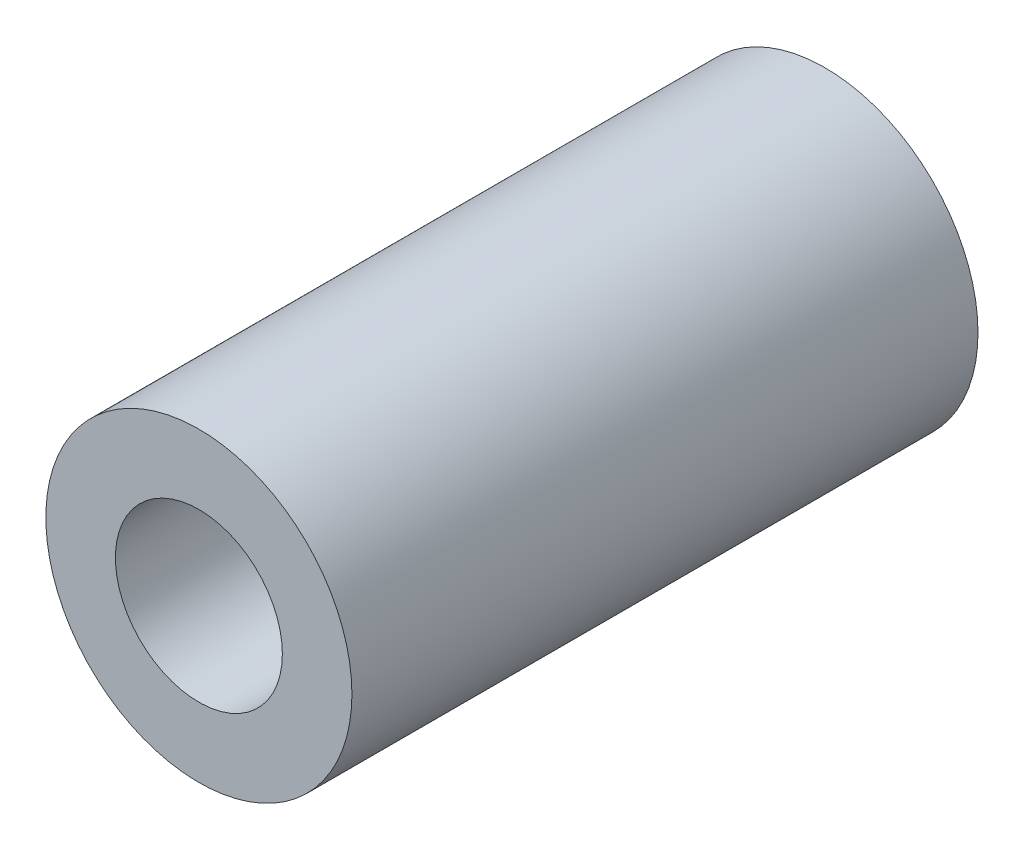
ISO-10303-21;
HEADER;
FILE_DESCRIPTION(('STEP AP214'),'2;1');
FILE_NAME('part.step','',(''),(''),'','','');
FILE_SCHEMA(('AUTOMOTIVE_DESIGN { 1 0 10303 214 1 1 1 1 }'));
ENDSEC;
DATA;
#1=APPLICATION_CONTEXT('core data for automotive mechanical design processes');
#2=APPLICATION_PROTOCOL_DEFINITION('international standard','automotive_design',2000,#1);
#3=PRODUCT_CONTEXT('',#1,'mechanical');
#4=PRODUCT('Part','Part','',(#3));
#5=PRODUCT_RELATED_PRODUCT_CATEGORY('part','',(#4));
#6=PRODUCT_DEFINITION_FORMATION('','',#4);
#7=PRODUCT_DEFINITION_CONTEXT('part definition',#1,'design');
#8=PRODUCT_DEFINITION('design','',#6,#7);
#9=PRODUCT_DEFINITION_SHAPE('','',#8);
#10=(LENGTH_UNIT() NAMED_UNIT(*) SI_UNIT(.MILLI.,.METRE.));
#11=(NAMED_UNIT(*) PLANE_ANGLE_UNIT() SI_UNIT($,.RADIAN.));
#12=(NAMED_UNIT(*) SI_UNIT($,.STERADIAN.) SOLID_ANGLE_UNIT());
#13=UNCERTAINTY_MEASURE_WITH_UNIT(LENGTH_MEASURE(1.E-05),#10,'distance_accuracy_value','');
#14=(GEOMETRIC_REPRESENTATION_CONTEXT(3) GLOBAL_UNCERTAINTY_ASSIGNED_CONTEXT((#13)) GLOBAL_UNIT_ASSIGNED_CONTEXT((#10,
#11,#12)) REPRESENTATION_CONTEXT('',''));
#15=CARTESIAN_POINT('',(0.,0.,0.));
#16=DIRECTION('',(0.,0.,1.));
#17=DIRECTION('',(1.,0.,0.));
#18=AXIS2_PLACEMENT_3D('',#15,#16,#17);
#19=CARTESIAN_POINT('',(0.,0.,9.));
#20=DIRECTION('',(0.,0.,1.));
#21=DIRECTION('',(1.,0.,0.));
#22=AXIS2_PLACEMENT_3D('',#19,#20,#21);
#23=PLANE('',#22);
#24=CARTESIAN_POINT('',(0.,0.,9.));
#25=DIRECTION('',(0.,0.,1.));
#26=DIRECTION('',(1.,0.,0.));
#27=AXIS2_PLACEMENT_3D('',#24,#25,#26);
#28=CIRCLE('',#27,2.2);
#29=CARTESIAN_POINT('',(2.2,0.,9.));
#30=VERTEX_POINT('',#29);
#31=EDGE_CURVE('E10',#30,#30,#28,.T.);
#32=ORIENTED_EDGE('',*,*,#31,.T.);
#33=EDGE_LOOP('',(#32));
#34=FACE_BOUND('',#33,.T.);
#35=CARTESIAN_POINT('',(0.,0.,9.));
#36=DIRECTION('',(0.,0.,1.));
#37=DIRECTION('',(1.,0.,0.));
#38=AXIS2_PLACEMENT_3D('',#35,#36,#37);
#39=CIRCLE('',#38,1.2);
#40=CARTESIAN_POINT('',(1.2,0.,9.));
#41=VERTEX_POINT('',#40);
#42=EDGE_CURVE('E44',#41,#41,#39,.T.);
#43=ORIENTED_EDGE('',*,*,#42,.F.);
#44=EDGE_LOOP('',(#43));
#45=FACE_BOUND('',#44,.T.);
#46=ADVANCED_FACE('F33',(#34,#45),#23,.T.);
#47=CARTESIAN_POINT('',(0.,0.,0.));
#48=DIRECTION('',(0.,0.,1.));
#49=DIRECTION('',(1.,0.,0.));
#50=AXIS2_PLACEMENT_3D('',#47,#48,#49);
#51=PLANE('',#50);
#52=CARTESIAN_POINT('',(0.,0.,0.));
#53=DIRECTION('',(0.,0.,1.));
#54=DIRECTION('',(1.,0.,0.));
#55=AXIS2_PLACEMENT_3D('',#52,#53,#54);
#56=CIRCLE('',#55,2.2);
#57=CARTESIAN_POINT('',(2.2,0.,0.));
#58=VERTEX_POINT('',#57);
#59=EDGE_CURVE('E37',#58,#58,#56,.T.);
#60=ORIENTED_EDGE('',*,*,#59,.F.);
#61=EDGE_LOOP('',(#60));
#62=FACE_BOUND('',#61,.T.);
#63=CARTESIAN_POINT('',(0.,0.,0.));
#64=DIRECTION('',(0.,0.,1.));
#65=DIRECTION('',(1.,0.,0.));
#66=AXIS2_PLACEMENT_3D('',#63,#64,#65);
#67=CIRCLE('',#66,1.2);
#68=CARTESIAN_POINT('',(1.2,0.,0.));
#69=VERTEX_POINT('',#68);
#70=EDGE_CURVE('E46',#69,#69,#67,.T.);
#71=ORIENTED_EDGE('',*,*,#70,.T.);
#72=EDGE_LOOP('',(#71));
#73=FACE_BOUND('',#72,.T.);
#74=ADVANCED_FACE('F56',(#62,#73),#51,.F.);
#75=CARTESIAN_POINT('',(0.,0.,9.));
#76=DIRECTION('',(0.,0.,-1.));
#77=DIRECTION('',(-1.,0.,0.));
#78=AXIS2_PLACEMENT_3D('',#75,#76,#77);
#79=CYLINDRICAL_SURFACE('',#78,2.2);
#80=ORIENTED_EDGE('',*,*,#31,.F.);
#81=EDGE_LOOP('',(#80));
#82=FACE_BOUND('',#81,.T.);
#83=ORIENTED_EDGE('',*,*,#59,.T.);
#84=EDGE_LOOP('',(#83));
#85=FACE_BOUND('',#84,.T.);
#86=ADVANCED_FACE('F35',(#82,#85),#79,.T.);
#87=CARTESIAN_POINT('',(0.,0.,9.));
#88=DIRECTION('',(0.,0.,-1.));
#89=DIRECTION('',(-1.,0.,0.));
#90=AXIS2_PLACEMENT_3D('',#87,#88,#89);
#91=CYLINDRICAL_SURFACE('',#90,1.2);
#92=ORIENTED_EDGE('',*,*,#42,.T.);
#93=EDGE_LOOP('',(#92));
#94=FACE_BOUND('',#93,.T.);
#95=ORIENTED_EDGE('',*,*,#70,.F.);
#96=EDGE_LOOP('',(#95));
#97=FACE_BOUND('',#96,.T.);
#98=ADVANCED_FACE('F52',(#94,#97),#91,.F.);
#99=CLOSED_SHELL('',(#46,#74,#86,#98));
#100=MANIFOLD_SOLID_BREP('B2',#99);
#101=ADVANCED_BREP_SHAPE_REPRESENTATION('',(#18,#100),#14);
#102=SHAPE_DEFINITION_REPRESENTATION(#9,#101);
ENDSEC;
END-ISO-10303-21;
